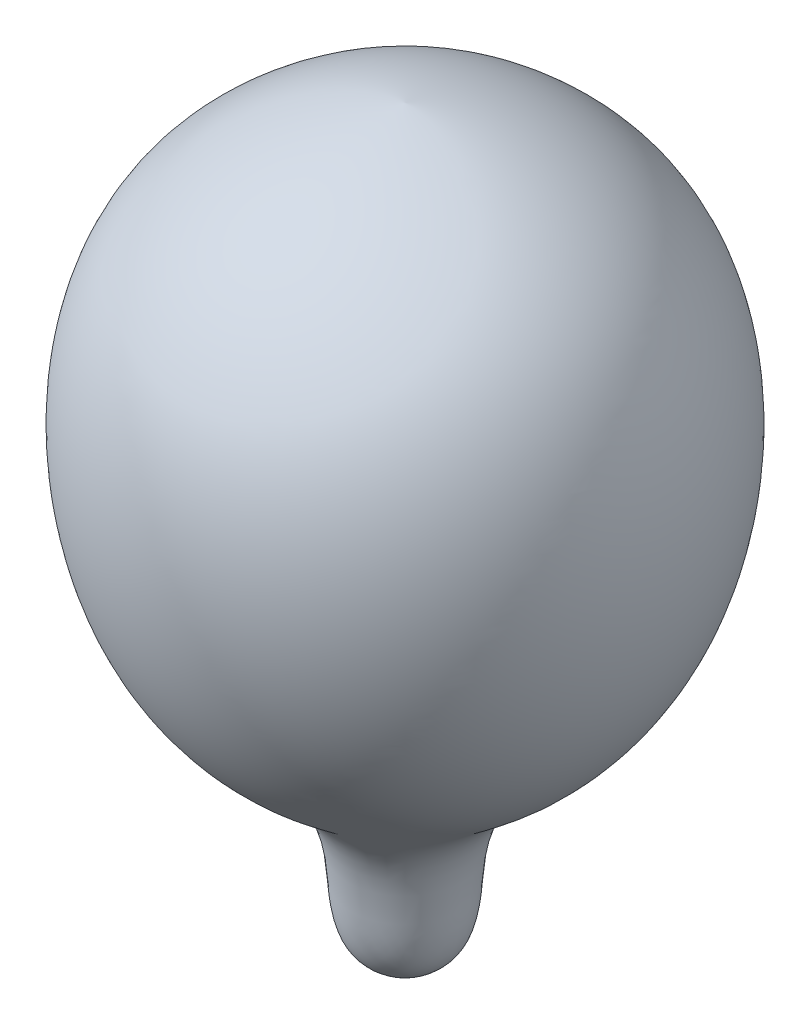
ISO-10303-21;
HEADER;
FILE_DESCRIPTION(('STEP AP214'),'2;1');
FILE_NAME('part.step','',(''),(''),'','','');
FILE_SCHEMA(('AUTOMOTIVE_DESIGN { 1 0 10303 214 1 1 1 1 }'));
ENDSEC;
DATA;
#1=APPLICATION_CONTEXT('core data for automotive mechanical design processes');
#2=APPLICATION_PROTOCOL_DEFINITION('international standard','automotive_design',2000,#1);
#3=PRODUCT_CONTEXT('',#1,'mechanical');
#4=PRODUCT('Part','Part','',(#3));
#5=PRODUCT_RELATED_PRODUCT_CATEGORY('part','',(#4));
#6=PRODUCT_DEFINITION_FORMATION('','',#4);
#7=PRODUCT_DEFINITION_CONTEXT('part definition',#1,'design');
#8=PRODUCT_DEFINITION('design','',#6,#7);
#9=PRODUCT_DEFINITION_SHAPE('','',#8);
#10=(LENGTH_UNIT() NAMED_UNIT(*) SI_UNIT(.MILLI.,.METRE.));
#11=(NAMED_UNIT(*) PLANE_ANGLE_UNIT() SI_UNIT($,.RADIAN.));
#12=(NAMED_UNIT(*) SI_UNIT($,.STERADIAN.) SOLID_ANGLE_UNIT());
#13=UNCERTAINTY_MEASURE_WITH_UNIT(LENGTH_MEASURE(1.E-05),#10,'distance_accuracy_value','');
#14=(GEOMETRIC_REPRESENTATION_CONTEXT(3) GLOBAL_UNCERTAINTY_ASSIGNED_CONTEXT((#13)) GLOBAL_UNIT_ASSIGNED_CONTEXT((#10,
#11,#12)) REPRESENTATION_CONTEXT('',''));
#15=CARTESIAN_POINT('',(0.,0.,0.));
#16=DIRECTION('',(0.,0.,1.));
#17=DIRECTION('',(1.,0.,0.));
#18=AXIS2_PLACEMENT_3D('',#15,#16,#17);
#19=CARTESIAN_POINT('',(0.,0.,0.));
#20=CARTESIAN_POINT('',(37.7047510958157,6.94569928640609,0.));
#21=CARTESIAN_POINT('',(33.8189770626954,46.6043483799832,0.));
#22=CARTESIAN_POINT('',(45.7734308509542,107.722714017214,0.));
#23=CARTESIAN_POINT('',(121.33651915112,151.522410807137,0.));
#24=CARTESIAN_POINT('',(181.830829811318,267.518824207825,0.));
#25=CARTESIAN_POINT('',(163.902843018974,443.638014570748,0.));
#26=CARTESIAN_POINT('',(50.7902566772821,496.039129861332,0.));
#27=CARTESIAN_POINT('',(0.,501.669276231725,0.));
#28=B_SPLINE_CURVE_WITH_KNOTS('',3,(#19,#20,#21,#22,#23,#24,#25,#26,#27),.UNSPECIFIED.,.F.,.F.,
(4,1,1,1,1,1,4),(0.,0.123631668222633,0.168215913955179,0.282552040659339,0.49436561092705,
0.75597246262563,1.),.UNSPECIFIED.);
#29=CARTESIAN_POINT('',(0.,726.941818067731,0.));
#30=DIRECTION('',(0.,1.,0.));
#31=AXIS1_PLACEMENT('',#29,#30);
#32=SURFACE_OF_REVOLUTION('',#28,#31);
#33=CARTESIAN_POINT('',(0.,501.669276231725,0.));
#34=VERTEX_POINT('',#33);
#35=VERTEX_LOOP('',#34);
#36=FACE_BOUND('',#35,.T.);
#37=CARTESIAN_POINT('',(0.,0.,0.));
#38=VERTEX_POINT('',#37);
#39=VERTEX_LOOP('',#38);
#40=FACE_BOUND('',#39,.T.);
#41=ADVANCED_FACE('F36',(#36,#40),#32,.T.);
#42=CLOSED_SHELL('',(#41));
#43=MANIFOLD_SOLID_BREP('B2',#42);
#44=ADVANCED_BREP_SHAPE_REPRESENTATION('',(#18,#43),#14);
#45=SHAPE_DEFINITION_REPRESENTATION(#9,#44);
ENDSEC;
END-ISO-10303-21;
